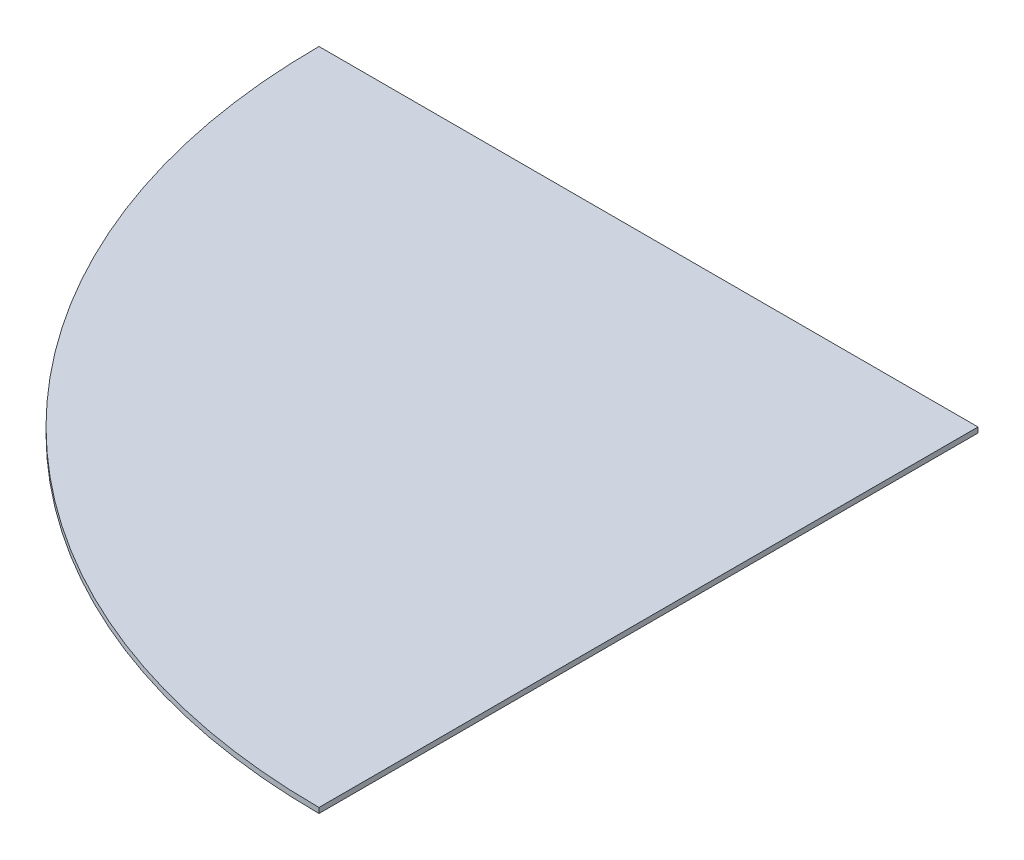
ISO-10303-21;
HEADER;
FILE_DESCRIPTION(('STEP AP214'),'2;1');
FILE_NAME('part.step','',(''),(''),'','','');
FILE_SCHEMA(('AUTOMOTIVE_DESIGN { 1 0 10303 214 1 1 1 1 }'));
ENDSEC;
DATA;
#1=APPLICATION_CONTEXT('core data for automotive mechanical design processes');
#2=APPLICATION_PROTOCOL_DEFINITION('international standard','automotive_design',2000,#1);
#3=PRODUCT_CONTEXT('',#1,'mechanical');
#4=PRODUCT('Part','Part','',(#3));
#5=PRODUCT_RELATED_PRODUCT_CATEGORY('part','',(#4));
#6=PRODUCT_DEFINITION_FORMATION('','',#4);
#7=PRODUCT_DEFINITION_CONTEXT('part definition',#1,'design');
#8=PRODUCT_DEFINITION('design','',#6,#7);
#9=PRODUCT_DEFINITION_SHAPE('','',#8);
#10=(LENGTH_UNIT() NAMED_UNIT(*) SI_UNIT(.MILLI.,.METRE.));
#11=(NAMED_UNIT(*) PLANE_ANGLE_UNIT() SI_UNIT($,.RADIAN.));
#12=(NAMED_UNIT(*) SI_UNIT($,.STERADIAN.) SOLID_ANGLE_UNIT());
#13=UNCERTAINTY_MEASURE_WITH_UNIT(LENGTH_MEASURE(1.E-05),#10,'distance_accuracy_value','');
#14=(GEOMETRIC_REPRESENTATION_CONTEXT(3) GLOBAL_UNCERTAINTY_ASSIGNED_CONTEXT((#13)) GLOBAL_UNIT_ASSIGNED_CONTEXT((#10,
#11,#12)) REPRESENTATION_CONTEXT('',''));
#15=CARTESIAN_POINT('',(0.,0.,0.));
#16=DIRECTION('',(0.,0.,1.));
#17=DIRECTION('',(1.,0.,0.));
#18=AXIS2_PLACEMENT_3D('',#15,#16,#17);
#19=CARTESIAN_POINT('',(-92.5,498.,92.5));
#20=DIRECTION('',(1.,0.,0.));
#21=DIRECTION('',(0.,0.,-1.));
#22=AXIS2_PLACEMENT_3D('',#19,#20,#21);
#23=PLANE('',#22);
#24=DIRECTION('',(0.,0.,-1.));
#25=VECTOR('',#24,1.);
#26=CARTESIAN_POINT('',(-92.5,500.,92.5));
#27=LINE('',#26,#25);
#28=CARTESIAN_POINT('',(-92.4999999999999,500.,342.5));
#29=VERTEX_POINT('',#28);
#30=CARTESIAN_POINT('',(-92.5,500.,92.5));
#31=VERTEX_POINT('',#30);
#32=EDGE_CURVE('E88',#29,#31,#27,.T.);
#33=ORIENTED_EDGE('',*,*,#32,.F.);
#34=DIRECTION('',(0.,1.,0.));
#35=VECTOR('',#34,1.);
#36=CARTESIAN_POINT('',(-92.4999999999999,498.,342.5));
#37=LINE('',#36,#35);
#38=CARTESIAN_POINT('',(-92.4999999999999,498.,342.5));
#39=VERTEX_POINT('',#38);
#40=EDGE_CURVE('E11',#39,#29,#37,.T.);
#41=ORIENTED_EDGE('',*,*,#40,.F.);
#42=DIRECTION('',(0.,0.,-1.));
#43=VECTOR('',#42,1.);
#44=CARTESIAN_POINT('',(-92.5,498.,92.5));
#45=LINE('',#44,#43);
#46=CARTESIAN_POINT('',(-92.5,498.,92.5));
#47=VERTEX_POINT('',#46);
#48=EDGE_CURVE('E80',#39,#47,#45,.T.);
#49=ORIENTED_EDGE('',*,*,#48,.T.);
#50=DIRECTION('',(0.,1.,0.));
#51=VECTOR('',#50,1.);
#52=CARTESIAN_POINT('',(-92.5,498.,92.5));
#53=LINE('',#52,#51);
#54=EDGE_CURVE('E39',#47,#31,#53,.T.);
#55=ORIENTED_EDGE('',*,*,#54,.T.);
#56=EDGE_LOOP('',(#33,#41,#49,#55));
#57=FACE_BOUND('',#56,.T.);
#58=ADVANCED_FACE('F36',(#57),#23,.T.);
#59=CARTESIAN_POINT('',(-92.4999999999999,498.,92.5000000000001));
#60=DIRECTION('',(0.,1.,0.));
#61=DIRECTION('',(0.,0.,1.));
#62=AXIS2_PLACEMENT_3D('',#59,#60,#61);
#63=CYLINDRICAL_SURFACE('',#62,250.);
#64=CARTESIAN_POINT('',(-92.4999999999999,500.,92.5000000000001));
#65=DIRECTION('',(0.,1.,0.));
#66=DIRECTION('',(0.,0.,1.));
#67=AXIS2_PLACEMENT_3D('',#64,#65,#66);
#68=CIRCLE('',#67,250.);
#69=CARTESIAN_POINT('',(-342.5,500.,92.5));
#70=VERTEX_POINT('',#69);
#71=EDGE_CURVE('E82',#70,#29,#68,.T.);
#72=ORIENTED_EDGE('',*,*,#71,.F.);
#73=DIRECTION('',(0.,1.,0.));
#74=VECTOR('',#73,1.);
#75=CARTESIAN_POINT('',(-342.5,498.,92.5));
#76=LINE('',#75,#74);
#77=CARTESIAN_POINT('',(-342.5,498.,92.5));
#78=VERTEX_POINT('',#77);
#79=EDGE_CURVE('E45',#78,#70,#76,.T.);
#80=ORIENTED_EDGE('',*,*,#79,.F.);
#81=CARTESIAN_POINT('',(-92.4999999999999,498.,92.5000000000001));
#82=DIRECTION('',(0.,1.,0.));
#83=DIRECTION('',(0.,0.,1.));
#84=AXIS2_PLACEMENT_3D('',#81,#82,#83);
#85=CIRCLE('',#84,250.);
#86=EDGE_CURVE('E77',#78,#39,#85,.T.);
#87=ORIENTED_EDGE('',*,*,#86,.T.);
#88=ORIENTED_EDGE('',*,*,#40,.T.);
#89=EDGE_LOOP('',(#72,#80,#87,#88));
#90=FACE_BOUND('',#89,.T.);
#91=ADVANCED_FACE('F92',(#90),#63,.T.);
#92=CARTESIAN_POINT('',(-92.5,498.,92.5));
#93=DIRECTION('',(0.,0.,-1.));
#94=DIRECTION('',(-1.,0.,0.));
#95=AXIS2_PLACEMENT_3D('',#92,#93,#94);
#96=PLANE('',#95);
#97=DIRECTION('',(-1.,0.,0.));
#98=VECTOR('',#97,1.);
#99=CARTESIAN_POINT('',(-92.5,500.,92.5));
#100=LINE('',#99,#98);
#101=EDGE_CURVE('E75',#31,#70,#100,.T.);
#102=ORIENTED_EDGE('',*,*,#101,.F.);
#103=ORIENTED_EDGE('',*,*,#54,.F.);
#104=DIRECTION('',(-1.,0.,0.));
#105=VECTOR('',#104,1.);
#106=CARTESIAN_POINT('',(-92.5,498.,92.5));
#107=LINE('',#106,#105);
#108=EDGE_CURVE('E73',#47,#78,#107,.T.);
#109=ORIENTED_EDGE('',*,*,#108,.T.);
#110=ORIENTED_EDGE('',*,*,#79,.T.);
#111=EDGE_LOOP('',(#102,#103,#109,#110));
#112=FACE_BOUND('',#111,.T.);
#113=ADVANCED_FACE('F72',(#112),#96,.T.);
#114=CARTESIAN_POINT('',(-92.4999999999999,498.,92.5000000000001));
#115=DIRECTION('',(0.,1.,0.));
#116=DIRECTION('',(0.,0.,1.));
#117=AXIS2_PLACEMENT_3D('',#114,#115,#116);
#118=PLANE('',#117);
#119=ORIENTED_EDGE('',*,*,#48,.F.);
#120=ORIENTED_EDGE('',*,*,#86,.F.);
#121=ORIENTED_EDGE('',*,*,#108,.F.);
#122=EDGE_LOOP('',(#119,#120,#121));
#123=FACE_BOUND('',#122,.T.);
#124=ADVANCED_FACE('F79',(#123),#118,.F.);
#125=CARTESIAN_POINT('',(-92.4999999999999,500.,92.5000000000001));
#126=DIRECTION('',(0.,1.,0.));
#127=DIRECTION('',(0.,0.,1.));
#128=AXIS2_PLACEMENT_3D('',#125,#126,#127);
#129=PLANE('',#128);
#130=ORIENTED_EDGE('',*,*,#32,.T.);
#131=ORIENTED_EDGE('',*,*,#101,.T.);
#132=ORIENTED_EDGE('',*,*,#71,.T.);
#133=EDGE_LOOP('',(#130,#131,#132));
#134=FACE_BOUND('',#133,.T.);
#135=ADVANCED_FACE('F91',(#134),#129,.T.);
#136=CLOSED_SHELL('',(#58,#91,#113,#124,#135));
#137=MANIFOLD_SOLID_BREP('B2',#136);
#138=ADVANCED_BREP_SHAPE_REPRESENTATION('',(#18,#137),#14);
#139=SHAPE_DEFINITION_REPRESENTATION(#9,#138);
ENDSEC;
END-ISO-10303-21;
